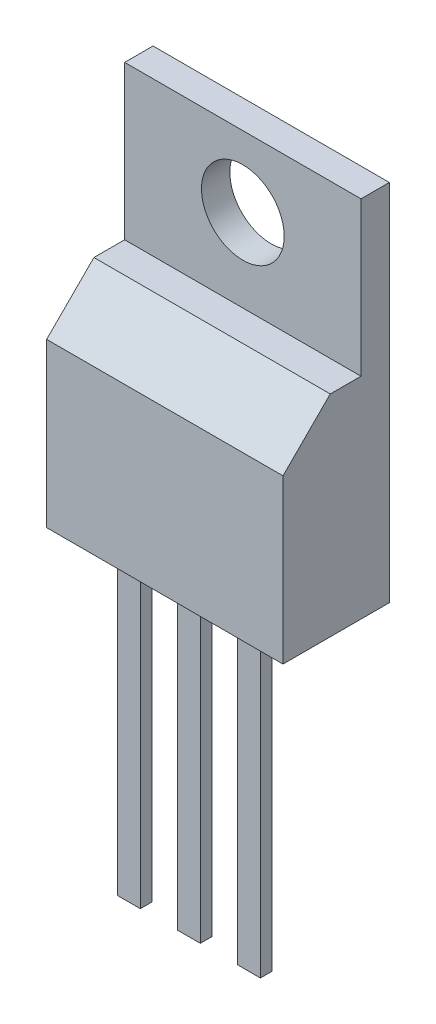
ISO-10303-21;
HEADER;
FILE_DESCRIPTION(('STEP AP214'),'2;1');
FILE_NAME('part.step','',(''),(''),'','','');
FILE_SCHEMA(('AUTOMOTIVE_DESIGN { 1 0 10303 214 1 1 1 1 }'));
ENDSEC;
DATA;
#1=APPLICATION_CONTEXT('core data for automotive mechanical design processes');
#2=APPLICATION_PROTOCOL_DEFINITION('international standard','automotive_design',2000,#1);
#3=PRODUCT_CONTEXT('',#1,'mechanical');
#4=PRODUCT('Part','Part','',(#3));
#5=PRODUCT_RELATED_PRODUCT_CATEGORY('part','',(#4));
#6=PRODUCT_DEFINITION_FORMATION('','',#4);
#7=PRODUCT_DEFINITION_CONTEXT('part definition',#1,'design');
#8=PRODUCT_DEFINITION('design','',#6,#7);
#9=PRODUCT_DEFINITION_SHAPE('','',#8);
#10=(LENGTH_UNIT() NAMED_UNIT(*) SI_UNIT(.MILLI.,.METRE.));
#11=(NAMED_UNIT(*) PLANE_ANGLE_UNIT() SI_UNIT($,.RADIAN.));
#12=(NAMED_UNIT(*) SI_UNIT($,.STERADIAN.) SOLID_ANGLE_UNIT());
#13=UNCERTAINTY_MEASURE_WITH_UNIT(LENGTH_MEASURE(1.E-05),#10,'distance_accuracy_value','');
#14=(GEOMETRIC_REPRESENTATION_CONTEXT(3) GLOBAL_UNCERTAINTY_ASSIGNED_CONTEXT((#13)) GLOBAL_UNIT_ASSIGNED_CONTEXT((#10,
#11,#12)) REPRESENTATION_CONTEXT('',''));
#15=CARTESIAN_POINT('',(0.,0.,0.));
#16=DIRECTION('',(0.,0.,1.));
#17=DIRECTION('',(1.,0.,0.));
#18=AXIS2_PLACEMENT_3D('',#15,#16,#17);
#19=CARTESIAN_POINT('',(-5.,0.,4.5));
#20=DIRECTION('',(0.,1.,0.));
#21=DIRECTION('',(-1.,0.,0.));
#22=AXIS2_PLACEMENT_3D('',#19,#20,#21);
#23=PLANE('',#22);
#24=DIRECTION('',(0.,0.,-1.));
#25=VECTOR('',#24,1.);
#26=CARTESIAN_POINT('',(2.0572012411108,0.,3.48));
#27=LINE('',#26,#25);
#28=CARTESIAN_POINT('',(2.0572012411108,0.,3.48));
#29=VERTEX_POINT('',#28);
#30=CARTESIAN_POINT('',(2.0572012411108,0.,2.98));
#31=VERTEX_POINT('',#30);
#32=EDGE_CURVE('E188',#29,#31,#27,.T.);
#33=ORIENTED_EDGE('',*,*,#32,.F.);
#34=DIRECTION('',(-1.,0.,0.));
#35=VECTOR('',#34,1.);
#36=CARTESIAN_POINT('',(2.0572012411108,0.,3.48));
#37=LINE('',#36,#35);
#38=CARTESIAN_POINT('',(3.0227987588892,0.,3.48));
#39=VERTEX_POINT('',#38);
#40=EDGE_CURVE('E201',#39,#29,#37,.T.);
#41=ORIENTED_EDGE('',*,*,#40,.F.);
#42=DIRECTION('',(0.,0.,1.));
#43=VECTOR('',#42,1.);
#44=CARTESIAN_POINT('',(3.0227987588892,0.,3.48));
#45=LINE('',#44,#43);
#46=CARTESIAN_POINT('',(3.0227987588892,0.,2.98));
#47=VERTEX_POINT('',#46);
#48=EDGE_CURVE('E210',#47,#39,#45,.T.);
#49=ORIENTED_EDGE('',*,*,#48,.F.);
#50=DIRECTION('',(1.,0.,0.));
#51=VECTOR('',#50,1.);
#52=CARTESIAN_POINT('',(2.0572012411108,0.,2.98));
#53=LINE('',#52,#51);
#54=EDGE_CURVE('E191',#31,#47,#53,.T.);
#55=ORIENTED_EDGE('',*,*,#54,.F.);
#56=EDGE_LOOP('',(#33,#41,#49,#55));
#57=FACE_BOUND('',#56,.T.);
#58=DIRECTION('',(1.,0.,0.));
#59=VECTOR('',#58,1.);
#60=CARTESIAN_POINT('',(-5.,0.,0.));
#61=LINE('',#60,#59);
#62=CARTESIAN_POINT('',(-5.,0.,0.));
#63=VERTEX_POINT('',#62);
#64=CARTESIAN_POINT('',(5.,0.,0.));
#65=VERTEX_POINT('',#64);
#66=EDGE_CURVE('E294',#63,#65,#61,.T.);
#67=ORIENTED_EDGE('',*,*,#66,.T.);
#68=DIRECTION('',(0.,0.,-1.));
#69=VECTOR('',#68,1.);
#70=CARTESIAN_POINT('',(5.,0.,4.5));
#71=LINE('',#70,#69);
#72=CARTESIAN_POINT('',(5.,0.,4.5));
#73=VERTEX_POINT('',#72);
#74=EDGE_CURVE('E304',#73,#65,#71,.T.);
#75=ORIENTED_EDGE('',*,*,#74,.F.);
#76=DIRECTION('',(1.,0.,0.));
#77=VECTOR('',#76,1.);
#78=CARTESIAN_POINT('',(-5.,0.,4.5));
#79=LINE('',#78,#77);
#80=CARTESIAN_POINT('',(-5.,0.,4.5));
#81=VERTEX_POINT('',#80);
#82=EDGE_CURVE('E285',#81,#73,#79,.T.);
#83=ORIENTED_EDGE('',*,*,#82,.F.);
#84=DIRECTION('',(0.,0.,-1.));
#85=VECTOR('',#84,1.);
#86=CARTESIAN_POINT('',(-5.,0.,4.5));
#87=LINE('',#86,#85);
#88=EDGE_CURVE('E307',#81,#63,#87,.T.);
#89=ORIENTED_EDGE('',*,*,#88,.T.);
#90=EDGE_LOOP('',(#67,#75,#83,#89));
#91=FACE_BOUND('',#90,.T.);
#92=DIRECTION('',(0.,0.,-1.));
#93=VECTOR('',#92,1.);
#94=CARTESIAN_POINT('',(-0.482798758889201,0.,3.48));
#95=LINE('',#94,#93);
#96=CARTESIAN_POINT('',(-0.482798758889201,0.,3.48));
#97=VERTEX_POINT('',#96);
#98=CARTESIAN_POINT('',(-0.482798758889201,0.,2.98));
#99=VERTEX_POINT('',#98);
#100=EDGE_CURVE('E226',#97,#99,#95,.T.);
#101=ORIENTED_EDGE('',*,*,#100,.F.);
#102=DIRECTION('',(-1.,0.,0.));
#103=VECTOR('',#102,1.);
#104=CARTESIAN_POINT('',(-0.482798758889201,0.,3.48));
#105=LINE('',#104,#103);
#106=CARTESIAN_POINT('',(0.482798758889204,0.,3.48));
#107=VERTEX_POINT('',#106);
#108=EDGE_CURVE('E231',#107,#97,#105,.T.);
#109=ORIENTED_EDGE('',*,*,#108,.F.);
#110=DIRECTION('',(0.,0.,1.));
#111=VECTOR('',#110,1.);
#112=CARTESIAN_POINT('',(0.482798758889201,0.,3.48));
#113=LINE('',#112,#111);
#114=CARTESIAN_POINT('',(0.482798758889201,0.,2.98));
#115=VERTEX_POINT('',#114);
#116=EDGE_CURVE('E243',#115,#107,#113,.T.);
#117=ORIENTED_EDGE('',*,*,#116,.F.);
#118=DIRECTION('',(1.,0.,0.));
#119=VECTOR('',#118,1.);
#120=CARTESIAN_POINT('',(-0.482798758889201,0.,2.98));
#121=LINE('',#120,#119);
#122=EDGE_CURVE('E240',#99,#115,#121,.T.);
#123=ORIENTED_EDGE('',*,*,#122,.F.);
#124=EDGE_LOOP('',(#101,#109,#117,#123));
#125=FACE_BOUND('',#124,.T.);
#126=DIRECTION('',(0.,0.,-1.));
#127=VECTOR('',#126,1.);
#128=CARTESIAN_POINT('',(-3.0227987588892,0.,3.47999999999998));
#129=LINE('',#128,#127);
#130=CARTESIAN_POINT('',(-3.0227987588892,0.,3.47999999999998));
#131=VERTEX_POINT('',#130);
#132=CARTESIAN_POINT('',(-3.0227987588892,0.,2.97999999999998));
#133=VERTEX_POINT('',#132);
#134=EDGE_CURVE('E187',#131,#133,#129,.T.);
#135=ORIENTED_EDGE('',*,*,#134,.F.);
#136=DIRECTION('',(-1.,0.,0.));
#137=VECTOR('',#136,1.);
#138=CARTESIAN_POINT('',(-3.0227987588892,0.,3.47999999999998));
#139=LINE('',#138,#137);
#140=CARTESIAN_POINT('',(-2.0572012411108,0.,3.47999999999998));
#141=VERTEX_POINT('',#140);
#142=EDGE_CURVE('E184',#141,#131,#139,.T.);
#143=ORIENTED_EDGE('',*,*,#142,.F.);
#144=DIRECTION('',(0.,0.,1.));
#145=VECTOR('',#144,1.);
#146=CARTESIAN_POINT('',(-2.0572012411108,0.,3.47999999999998));
#147=LINE('',#146,#145);
#148=CARTESIAN_POINT('',(-2.0572012411108,0.,2.97999999999998));
#149=VERTEX_POINT('',#148);
#150=EDGE_CURVE('E57',#149,#141,#147,.T.);
#151=ORIENTED_EDGE('',*,*,#150,.F.);
#152=DIRECTION('',(1.,0.,0.));
#153=VECTOR('',#152,1.);
#154=CARTESIAN_POINT('',(-3.0227987588892,0.,2.97999999999998));
#155=LINE('',#154,#153);
#156=EDGE_CURVE('E52',#133,#149,#155,.T.);
#157=ORIENTED_EDGE('',*,*,#156,.F.);
#158=EDGE_LOOP('',(#135,#143,#151,#157));
#159=FACE_BOUND('',#158,.T.);
#160=ADVANCED_FACE('F37',(#57,#91,#125,#159),#23,.F.);
#161=CARTESIAN_POINT('',(-4.99999999999999,15.4,4.5));
#162=DIRECTION('',(0.,-1.,0.));
#163=DIRECTION('',(1.,0.,0.));
#164=AXIS2_PLACEMENT_3D('',#161,#162,#163);
#165=PLANE('',#164);
#166=DIRECTION('',(1.,0.,0.));
#167=VECTOR('',#166,1.);
#168=CARTESIAN_POINT('',(-4.99999999999999,15.4,1.2));
#169=LINE('',#168,#167);
#170=CARTESIAN_POINT('',(-4.99999999999999,15.4,1.2));
#171=VERTEX_POINT('',#170);
#172=CARTESIAN_POINT('',(5.,15.4,1.2));
#173=VERTEX_POINT('',#172);
#174=EDGE_CURVE('E269',#171,#173,#169,.T.);
#175=ORIENTED_EDGE('',*,*,#174,.T.);
#176=DIRECTION('',(0.,0.,-1.));
#177=VECTOR('',#176,1.);
#178=CARTESIAN_POINT('',(5.,15.4,4.5));
#179=LINE('',#178,#177);
#180=CARTESIAN_POINT('',(5.,15.4,0.));
#181=VERTEX_POINT('',#180);
#182=EDGE_CURVE('E302',#173,#181,#179,.T.);
#183=ORIENTED_EDGE('',*,*,#182,.T.);
#184=DIRECTION('',(-1.,0.,0.));
#185=VECTOR('',#184,1.);
#186=CARTESIAN_POINT('',(-4.99999999999999,15.4,0.));
#187=LINE('',#186,#185);
#188=CARTESIAN_POINT('',(-4.99999999999999,15.4,0.));
#189=VERTEX_POINT('',#188);
#190=EDGE_CURVE('E286',#181,#189,#187,.T.);
#191=ORIENTED_EDGE('',*,*,#190,.T.);
#192=DIRECTION('',(0.,0.,-1.));
#193=VECTOR('',#192,1.);
#194=CARTESIAN_POINT('',(-4.99999999999999,15.4,4.5));
#195=LINE('',#194,#193);
#196=EDGE_CURVE('E291',#171,#189,#195,.T.);
#197=ORIENTED_EDGE('',*,*,#196,.F.);
#198=EDGE_LOOP('',(#175,#183,#191,#197));
#199=FACE_BOUND('',#198,.T.);
#200=ADVANCED_FACE('F338',(#199),#165,.F.);
#201=CARTESIAN_POINT('',(-4.99999999999999,15.4,4.5));
#202=DIRECTION('',(1.,0.,0.));
#203=DIRECTION('',(0.,1.,0.));
#204=AXIS2_PLACEMENT_3D('',#201,#202,#203);
#205=PLANE('',#204);
#206=DIRECTION('',(0.,-1.,0.));
#207=VECTOR('',#206,1.);
#208=CARTESIAN_POINT('',(-4.99999999999999,15.4,4.5));
#209=LINE('',#208,#207);
#210=CARTESIAN_POINT('',(-5.,6.89999999999999,4.5));
#211=VERTEX_POINT('',#210);
#212=EDGE_CURVE('E283',#211,#81,#209,.T.);
#213=ORIENTED_EDGE('',*,*,#212,.F.);
#214=DIRECTION('',(0.,0.707106781186549,-0.707106781186546));
#215=VECTOR('',#214,1.);
#216=CARTESIAN_POINT('',(-5.,8.9,2.5));
#217=LINE('',#216,#215);
#218=CARTESIAN_POINT('',(-5.,8.9,2.49999999999999));
#219=VERTEX_POINT('',#218);
#220=EDGE_CURVE('E12',#211,#219,#217,.T.);
#221=ORIENTED_EDGE('',*,*,#220,.T.);
#222=DIRECTION('',(0.,0.,1.));
#223=VECTOR('',#222,1.);
#224=CARTESIAN_POINT('',(-4.99999999999999,8.9,-11.9268604418766));
#225=LINE('',#224,#223);
#226=CARTESIAN_POINT('',(-4.99999999999999,8.9,1.2));
#227=VERTEX_POINT('',#226);
#228=EDGE_CURVE('E263',#227,#219,#225,.T.);
#229=ORIENTED_EDGE('',*,*,#228,.F.);
#230=DIRECTION('',(0.,1.,0.));
#231=VECTOR('',#230,1.);
#232=CARTESIAN_POINT('',(-4.99999999999999,15.4,1.2));
#233=LINE('',#232,#231);
#234=EDGE_CURVE('E273',#227,#171,#233,.T.);
#235=ORIENTED_EDGE('',*,*,#234,.T.);
#236=ORIENTED_EDGE('',*,*,#196,.T.);
#237=DIRECTION('',(0.,-1.,0.));
#238=VECTOR('',#237,1.);
#239=CARTESIAN_POINT('',(-4.99999999999999,15.4,0.));
#240=LINE('',#239,#238);
#241=EDGE_CURVE('E282',#189,#63,#240,.T.);
#242=ORIENTED_EDGE('',*,*,#241,.T.);
#243=ORIENTED_EDGE('',*,*,#88,.F.);
#244=EDGE_LOOP('',(#213,#221,#229,#235,#236,#242,#243));
#245=FACE_BOUND('',#244,.T.);
#246=ADVANCED_FACE('F324',(#245),#205,.F.);
#247=CARTESIAN_POINT('',(5.,15.4,4.5));
#248=DIRECTION('',(-1.,0.,0.));
#249=DIRECTION('',(0.,-1.,0.));
#250=AXIS2_PLACEMENT_3D('',#247,#248,#249);
#251=PLANE('',#250);
#252=DIRECTION('',(0.,0.,1.));
#253=VECTOR('',#252,1.);
#254=CARTESIAN_POINT('',(5.,8.9,-11.9268604418766));
#255=LINE('',#254,#253);
#256=CARTESIAN_POINT('',(5.,8.9,1.2));
#257=VERTEX_POINT('',#256);
#258=CARTESIAN_POINT('',(5.,8.9,2.49999999999999));
#259=VERTEX_POINT('',#258);
#260=EDGE_CURVE('E270',#257,#259,#255,.T.);
#261=ORIENTED_EDGE('',*,*,#260,.T.);
#262=DIRECTION('',(0.,-0.707106781186549,0.707106781186546));
#263=VECTOR('',#262,1.);
#264=CARTESIAN_POINT('',(5.,8.9,2.5));
#265=LINE('',#264,#263);
#266=CARTESIAN_POINT('',(5.,6.89999999999999,4.5));
#267=VERTEX_POINT('',#266);
#268=EDGE_CURVE('E313',#259,#267,#265,.T.);
#269=ORIENTED_EDGE('',*,*,#268,.T.);
#270=DIRECTION('',(0.,1.,0.));
#271=VECTOR('',#270,1.);
#272=CARTESIAN_POINT('',(5.,15.4,4.5));
#273=LINE('',#272,#271);
#274=EDGE_CURVE('E288',#73,#267,#273,.T.);
#275=ORIENTED_EDGE('',*,*,#274,.F.);
#276=ORIENTED_EDGE('',*,*,#74,.T.);
#277=DIRECTION('',(0.,1.,0.));
#278=VECTOR('',#277,1.);
#279=CARTESIAN_POINT('',(5.,15.4,0.));
#280=LINE('',#279,#278);
#281=EDGE_CURVE('E296',#65,#181,#280,.T.);
#282=ORIENTED_EDGE('',*,*,#281,.T.);
#283=ORIENTED_EDGE('',*,*,#182,.F.);
#284=DIRECTION('',(0.,-1.,0.));
#285=VECTOR('',#284,1.);
#286=CARTESIAN_POINT('',(5.,15.4,1.2));
#287=LINE('',#286,#285);
#288=EDGE_CURVE('E266',#173,#257,#287,.T.);
#289=ORIENTED_EDGE('',*,*,#288,.T.);
#290=EDGE_LOOP('',(#261,#269,#275,#276,#282,#283,#289));
#291=FACE_BOUND('',#290,.T.);
#292=ADVANCED_FACE('F331',(#291),#251,.F.);
#293=CARTESIAN_POINT('',(0.,0.,4.5));
#294=DIRECTION('',(0.,0.,1.));
#295=DIRECTION('',(1.,0.,0.));
#296=AXIS2_PLACEMENT_3D('',#293,#294,#295);
#297=PLANE('',#296);
#298=ORIENTED_EDGE('',*,*,#274,.T.);
#299=DIRECTION('',(-1.,0.,0.));
#300=VECTOR('',#299,1.);
#301=CARTESIAN_POINT('',(-5.,6.89999999999999,4.5));
#302=LINE('',#301,#300);
#303=EDGE_CURVE('E45',#267,#211,#302,.T.);
#304=ORIENTED_EDGE('',*,*,#303,.T.);
#305=ORIENTED_EDGE('',*,*,#212,.T.);
#306=ORIENTED_EDGE('',*,*,#82,.T.);
#307=EDGE_LOOP('',(#298,#304,#305,#306));
#308=FACE_BOUND('',#307,.T.);
#309=ADVANCED_FACE('F317',(#308),#297,.T.);
#310=CARTESIAN_POINT('',(0.,0.,0.));
#311=DIRECTION('',(0.,0.,1.));
#312=DIRECTION('',(1.,0.,0.));
#313=AXIS2_PLACEMENT_3D('',#310,#311,#312);
#314=PLANE('',#313);
#315=CARTESIAN_POINT('',(0.,12.4,0.));
#316=DIRECTION('',(0.,0.,1.));
#317=DIRECTION('',(1.,0.,0.));
#318=AXIS2_PLACEMENT_3D('',#315,#316,#317);
#319=CIRCLE('',#318,1.75);
#320=CARTESIAN_POINT('',(1.75,12.4,0.));
#321=VERTEX_POINT('',#320);
#322=EDGE_CURVE('E260',#321,#321,#319,.T.);
#323=ORIENTED_EDGE('',*,*,#322,.T.);
#324=EDGE_LOOP('',(#323));
#325=FACE_BOUND('',#324,.T.);
#326=ORIENTED_EDGE('',*,*,#241,.F.);
#327=ORIENTED_EDGE('',*,*,#190,.F.);
#328=ORIENTED_EDGE('',*,*,#281,.F.);
#329=ORIENTED_EDGE('',*,*,#66,.F.);
#330=EDGE_LOOP('',(#326,#327,#328,#329));
#331=FACE_BOUND('',#330,.T.);
#332=ADVANCED_FACE('F342',(#325,#331),#314,.F.);
#333=CARTESIAN_POINT('',(-4.99999999999999,8.9,-11.9268604418766));
#334=DIRECTION('',(0.,-1.,0.));
#335=DIRECTION('',(0.,0.,-1.));
#336=AXIS2_PLACEMENT_3D('',#333,#334,#335);
#337=PLANE('',#336);
#338=ORIENTED_EDGE('',*,*,#228,.T.);
#339=DIRECTION('',(1.,0.,0.));
#340=VECTOR('',#339,1.);
#341=CARTESIAN_POINT('',(5.,8.9,2.5));
#342=LINE('',#341,#340);
#343=EDGE_CURVE('E310',#219,#259,#342,.T.);
#344=ORIENTED_EDGE('',*,*,#343,.T.);
#345=ORIENTED_EDGE('',*,*,#260,.F.);
#346=DIRECTION('',(-1.,0.,0.));
#347=VECTOR('',#346,1.);
#348=CARTESIAN_POINT('',(-4.99999999999999,8.9,1.2));
#349=LINE('',#348,#347);
#350=EDGE_CURVE('E276',#257,#227,#349,.T.);
#351=ORIENTED_EDGE('',*,*,#350,.T.);
#352=EDGE_LOOP('',(#338,#344,#345,#351));
#353=FACE_BOUND('',#352,.T.);
#354=ADVANCED_FACE('F328',(#353),#337,.F.);
#355=CARTESIAN_POINT('',(0.,0.,1.2));
#356=DIRECTION('',(0.,0.,1.));
#357=DIRECTION('',(1.,0.,0.));
#358=AXIS2_PLACEMENT_3D('',#355,#356,#357);
#359=PLANE('',#358);
#360=CARTESIAN_POINT('',(0.,12.4,1.2));
#361=DIRECTION('',(0.,0.,1.));
#362=DIRECTION('',(1.,0.,0.));
#363=AXIS2_PLACEMENT_3D('',#360,#361,#362);
#364=CIRCLE('',#363,1.75);
#365=CARTESIAN_POINT('',(1.75,12.4,1.2));
#366=VERTEX_POINT('',#365);
#367=EDGE_CURVE('E259',#366,#366,#364,.T.);
#368=ORIENTED_EDGE('',*,*,#367,.F.);
#369=EDGE_LOOP('',(#368));
#370=FACE_BOUND('',#369,.T.);
#371=ORIENTED_EDGE('',*,*,#234,.F.);
#372=ORIENTED_EDGE('',*,*,#350,.F.);
#373=ORIENTED_EDGE('',*,*,#288,.F.);
#374=ORIENTED_EDGE('',*,*,#174,.F.);
#375=EDGE_LOOP('',(#371,#372,#373,#374));
#376=FACE_BOUND('',#375,.T.);
#377=ADVANCED_FACE('F335',(#370,#376),#359,.T.);
#378=CARTESIAN_POINT('',(-4.99999999999999,8.9,2.5));
#379=DIRECTION('',(0.,0.707106781186546,0.707106781186549));
#380=DIRECTION('',(-1.,0.,0.));
#381=AXIS2_PLACEMENT_3D('',#378,#379,#380);
#382=PLANE('',#381);
#383=ORIENTED_EDGE('',*,*,#220,.F.);
#384=ORIENTED_EDGE('',*,*,#303,.F.);
#385=ORIENTED_EDGE('',*,*,#268,.F.);
#386=ORIENTED_EDGE('',*,*,#343,.F.);
#387=EDGE_LOOP('',(#383,#384,#385,#386));
#388=FACE_BOUND('',#387,.T.);
#389=ADVANCED_FACE('F39',(#388),#382,.T.);
#390=CARTESIAN_POINT('',(0.,12.4,0.));
#391=DIRECTION('',(0.,0.,1.));
#392=DIRECTION('',(1.,0.,0.));
#393=AXIS2_PLACEMENT_3D('',#390,#391,#392);
#394=CYLINDRICAL_SURFACE('',#393,1.75);
#395=ORIENTED_EDGE('',*,*,#322,.F.);
#396=EDGE_LOOP('',(#395));
#397=FACE_BOUND('',#396,.T.);
#398=ORIENTED_EDGE('',*,*,#367,.T.);
#399=EDGE_LOOP('',(#398));
#400=FACE_BOUND('',#399,.T.);
#401=ADVANCED_FACE('F416',(#397,#400),#394,.F.);
#402=CARTESIAN_POINT('',(-0.482798758889199,-13.,3.48));
#403=DIRECTION('',(1.,0.,0.));
#404=DIRECTION('',(0.,1.,0.));
#405=AXIS2_PLACEMENT_3D('',#402,#403,#404);
#406=PLANE('',#405);
#407=ORIENTED_EDGE('',*,*,#100,.T.);
#408=DIRECTION('',(0.,1.,0.));
#409=VECTOR('',#408,1.);
#410=CARTESIAN_POINT('',(-0.482798758889199,-13.,2.98));
#411=LINE('',#410,#409);
#412=CARTESIAN_POINT('',(-0.482798758889199,-13.,2.98));
#413=VERTEX_POINT('',#412);
#414=EDGE_CURVE('E256',#413,#99,#411,.T.);
#415=ORIENTED_EDGE('',*,*,#414,.F.);
#416=DIRECTION('',(0.,0.,-1.));
#417=VECTOR('',#416,1.);
#418=CARTESIAN_POINT('',(-0.482798758889199,-13.,3.48));
#419=LINE('',#418,#417);
#420=CARTESIAN_POINT('',(-0.482798758889199,-13.,3.48));
#421=VERTEX_POINT('',#420);
#422=EDGE_CURVE('E227',#421,#413,#419,.T.);
#423=ORIENTED_EDGE('',*,*,#422,.F.);
#424=DIRECTION('',(0.,1.,0.));
#425=VECTOR('',#424,1.);
#426=CARTESIAN_POINT('',(-0.482798758889199,-13.,3.48));
#427=LINE('',#426,#425);
#428=EDGE_CURVE('E237',#421,#97,#427,.T.);
#429=ORIENTED_EDGE('',*,*,#428,.T.);
#430=EDGE_LOOP('',(#407,#415,#423,#429));
#431=FACE_BOUND('',#430,.T.);
#432=ADVANCED_FACE('F412',(#431),#406,.F.);
#433=CARTESIAN_POINT('',(-0.482798758889199,-13.,2.98));
#434=DIRECTION('',(0.,0.,1.));
#435=DIRECTION('',(1.,0.,0.));
#436=AXIS2_PLACEMENT_3D('',#433,#434,#435);
#437=PLANE('',#436);
#438=ORIENTED_EDGE('',*,*,#122,.T.);
#439=DIRECTION('',(0.,1.,0.));
#440=VECTOR('',#439,1.);
#441=CARTESIAN_POINT('',(0.482798758889203,-13.,2.98));
#442=LINE('',#441,#440);
#443=CARTESIAN_POINT('',(0.482798758889203,-13.,2.98));
#444=VERTEX_POINT('',#443);
#445=EDGE_CURVE('E253',#444,#115,#442,.T.);
#446=ORIENTED_EDGE('',*,*,#445,.F.);
#447=DIRECTION('',(1.,0.,0.));
#448=VECTOR('',#447,1.);
#449=CARTESIAN_POINT('',(-0.482798758889199,-13.,2.98));
#450=LINE('',#449,#448);
#451=EDGE_CURVE('E230',#413,#444,#450,.T.);
#452=ORIENTED_EDGE('',*,*,#451,.F.);
#453=ORIENTED_EDGE('',*,*,#414,.T.);
#454=EDGE_LOOP('',(#438,#446,#452,#453));
#455=FACE_BOUND('',#454,.T.);
#456=ADVANCED_FACE('F408',(#455),#437,.F.);
#457=CARTESIAN_POINT('',(0.482798758889203,-13.,3.48));
#458=DIRECTION('',(-1.,0.,0.));
#459=DIRECTION('',(0.,-1.,0.));
#460=AXIS2_PLACEMENT_3D('',#457,#458,#459);
#461=PLANE('',#460);
#462=ORIENTED_EDGE('',*,*,#116,.T.);
#463=DIRECTION('',(0.,1.,0.));
#464=VECTOR('',#463,1.);
#465=CARTESIAN_POINT('',(0.482798758889203,-13.,3.48));
#466=LINE('',#465,#464);
#467=CARTESIAN_POINT('',(0.482798758889203,-13.,3.48));
#468=VERTEX_POINT('',#467);
#469=EDGE_CURVE('E250',#468,#107,#466,.T.);
#470=ORIENTED_EDGE('',*,*,#469,.F.);
#471=DIRECTION('',(0.,0.,1.));
#472=VECTOR('',#471,1.);
#473=CARTESIAN_POINT('',(0.482798758889203,-13.,3.48));
#474=LINE('',#473,#472);
#475=EDGE_CURVE('E233',#444,#468,#474,.T.);
#476=ORIENTED_EDGE('',*,*,#475,.F.);
#477=ORIENTED_EDGE('',*,*,#445,.T.);
#478=EDGE_LOOP('',(#462,#470,#476,#477));
#479=FACE_BOUND('',#478,.T.);
#480=ADVANCED_FACE('F404',(#479),#461,.F.);
#481=CARTESIAN_POINT('',(-0.482798758889199,-13.,3.48));
#482=DIRECTION('',(0.,0.,-1.));
#483=DIRECTION('',(-1.,0.,0.));
#484=AXIS2_PLACEMENT_3D('',#481,#482,#483);
#485=PLANE('',#484);
#486=ORIENTED_EDGE('',*,*,#108,.T.);
#487=ORIENTED_EDGE('',*,*,#428,.F.);
#488=DIRECTION('',(-1.,0.,0.));
#489=VECTOR('',#488,1.);
#490=CARTESIAN_POINT('',(-0.482798758889199,-13.,3.48));
#491=LINE('',#490,#489);
#492=EDGE_CURVE('E235',#468,#421,#491,.T.);
#493=ORIENTED_EDGE('',*,*,#492,.F.);
#494=ORIENTED_EDGE('',*,*,#469,.T.);
#495=EDGE_LOOP('',(#486,#487,#493,#494));
#496=FACE_BOUND('',#495,.T.);
#497=ADVANCED_FACE('F400',(#496),#485,.F.);
#498=CARTESIAN_POINT('',(0.,-13.,0.));
#499=DIRECTION('',(0.,-1.,0.));
#500=DIRECTION('',(1.,0.,0.));
#501=AXIS2_PLACEMENT_3D('',#498,#499,#500);
#502=PLANE('',#501);
#503=ORIENTED_EDGE('',*,*,#422,.T.);
#504=ORIENTED_EDGE('',*,*,#451,.T.);
#505=ORIENTED_EDGE('',*,*,#475,.T.);
#506=ORIENTED_EDGE('',*,*,#492,.T.);
#507=EDGE_LOOP('',(#503,#504,#505,#506));
#508=FACE_BOUND('',#507,.T.);
#509=ADVANCED_FACE('F396',(#508),#502,.T.);
#510=CARTESIAN_POINT('',(2.0572012411108,-13.,3.48));
#511=DIRECTION('',(1.,0.,0.));
#512=DIRECTION('',(0.,1.,0.));
#513=AXIS2_PLACEMENT_3D('',#510,#511,#512);
#514=PLANE('',#513);
#515=ORIENTED_EDGE('',*,*,#32,.T.);
#516=DIRECTION('',(0.,1.,0.));
#517=VECTOR('',#516,1.);
#518=CARTESIAN_POINT('',(2.0572012411108,-13.,2.98));
#519=LINE('',#518,#517);
#520=CARTESIAN_POINT('',(2.0572012411108,-13.,2.98));
#521=VERTEX_POINT('',#520);
#522=EDGE_CURVE('E223',#521,#31,#519,.T.);
#523=ORIENTED_EDGE('',*,*,#522,.F.);
#524=DIRECTION('',(0.,0.,-1.));
#525=VECTOR('',#524,1.);
#526=CARTESIAN_POINT('',(2.0572012411108,-13.,3.48));
#527=LINE('',#526,#525);
#528=CARTESIAN_POINT('',(2.0572012411108,-13.,3.48));
#529=VERTEX_POINT('',#528);
#530=EDGE_CURVE('E197',#529,#521,#527,.T.);
#531=ORIENTED_EDGE('',*,*,#530,.F.);
#532=DIRECTION('',(0.,1.,0.));
#533=VECTOR('',#532,1.);
#534=CARTESIAN_POINT('',(2.0572012411108,-13.,3.48));
#535=LINE('',#534,#533);
#536=EDGE_CURVE('E206',#529,#29,#535,.T.);
#537=ORIENTED_EDGE('',*,*,#536,.T.);
#538=EDGE_LOOP('',(#515,#523,#531,#537));
#539=FACE_BOUND('',#538,.T.);
#540=ADVANCED_FACE('F392',(#539),#514,.F.);
#541=CARTESIAN_POINT('',(2.0572012411108,-13.,2.98));
#542=DIRECTION('',(0.,0.,1.));
#543=DIRECTION('',(1.,0.,0.));
#544=AXIS2_PLACEMENT_3D('',#541,#542,#543);
#545=PLANE('',#544);
#546=ORIENTED_EDGE('',*,*,#54,.T.);
#547=DIRECTION('',(0.,1.,0.));
#548=VECTOR('',#547,1.);
#549=CARTESIAN_POINT('',(3.0227987588892,-13.,2.98));
#550=LINE('',#549,#548);
#551=CARTESIAN_POINT('',(3.0227987588892,-13.,2.98));
#552=VERTEX_POINT('',#551);
#553=EDGE_CURVE('E220',#552,#47,#550,.T.);
#554=ORIENTED_EDGE('',*,*,#553,.F.);
#555=DIRECTION('',(1.,0.,0.));
#556=VECTOR('',#555,1.);
#557=CARTESIAN_POINT('',(2.0572012411108,-13.,2.98));
#558=LINE('',#557,#556);
#559=EDGE_CURVE('E200',#521,#552,#558,.T.);
#560=ORIENTED_EDGE('',*,*,#559,.F.);
#561=ORIENTED_EDGE('',*,*,#522,.T.);
#562=EDGE_LOOP('',(#546,#554,#560,#561));
#563=FACE_BOUND('',#562,.T.);
#564=ADVANCED_FACE('F388',(#563),#545,.F.);
#565=CARTESIAN_POINT('',(3.0227987588892,-13.,3.48));
#566=DIRECTION('',(-1.,0.,0.));
#567=DIRECTION('',(0.,-1.,0.));
#568=AXIS2_PLACEMENT_3D('',#565,#566,#567);
#569=PLANE('',#568);
#570=ORIENTED_EDGE('',*,*,#48,.T.);
#571=DIRECTION('',(0.,1.,0.));
#572=VECTOR('',#571,1.);
#573=CARTESIAN_POINT('',(3.0227987588892,-13.,3.48));
#574=LINE('',#573,#572);
#575=CARTESIAN_POINT('',(3.0227987588892,-13.,3.48));
#576=VERTEX_POINT('',#575);
#577=EDGE_CURVE('E217',#576,#39,#574,.T.);
#578=ORIENTED_EDGE('',*,*,#577,.F.);
#579=DIRECTION('',(0.,0.,1.));
#580=VECTOR('',#579,1.);
#581=CARTESIAN_POINT('',(3.0227987588892,-13.,3.48));
#582=LINE('',#581,#580);
#583=EDGE_CURVE('E203',#552,#576,#582,.T.);
#584=ORIENTED_EDGE('',*,*,#583,.F.);
#585=ORIENTED_EDGE('',*,*,#553,.T.);
#586=EDGE_LOOP('',(#570,#578,#584,#585));
#587=FACE_BOUND('',#586,.T.);
#588=ADVANCED_FACE('F384',(#587),#569,.F.);
#589=CARTESIAN_POINT('',(2.0572012411108,-13.,3.48));
#590=DIRECTION('',(0.,0.,-1.));
#591=DIRECTION('',(-1.,0.,0.));
#592=AXIS2_PLACEMENT_3D('',#589,#590,#591);
#593=PLANE('',#592);
#594=ORIENTED_EDGE('',*,*,#40,.T.);
#595=ORIENTED_EDGE('',*,*,#536,.F.);
#596=DIRECTION('',(-1.,0.,0.));
#597=VECTOR('',#596,1.);
#598=CARTESIAN_POINT('',(2.0572012411108,-13.,3.48));
#599=LINE('',#598,#597);
#600=EDGE_CURVE('E205',#576,#529,#599,.T.);
#601=ORIENTED_EDGE('',*,*,#600,.F.);
#602=ORIENTED_EDGE('',*,*,#577,.T.);
#603=EDGE_LOOP('',(#594,#595,#601,#602));
#604=FACE_BOUND('',#603,.T.);
#605=ADVANCED_FACE('F380',(#604),#593,.F.);
#606=CARTESIAN_POINT('',(0.,-13.,0.));
#607=DIRECTION('',(0.,-1.,0.));
#608=DIRECTION('',(1.,0.,0.));
#609=AXIS2_PLACEMENT_3D('',#606,#607,#608);
#610=PLANE('',#609);
#611=ORIENTED_EDGE('',*,*,#530,.T.);
#612=ORIENTED_EDGE('',*,*,#559,.T.);
#613=ORIENTED_EDGE('',*,*,#583,.T.);
#614=ORIENTED_EDGE('',*,*,#600,.T.);
#615=EDGE_LOOP('',(#611,#612,#613,#614));
#616=FACE_BOUND('',#615,.T.);
#617=ADVANCED_FACE('F377',(#616),#610,.T.);
#618=CARTESIAN_POINT('',(-3.0227987588892,-13.,3.47999999999998));
#619=DIRECTION('',(1.,0.,0.));
#620=DIRECTION('',(0.,1.,0.));
#621=AXIS2_PLACEMENT_3D('',#618,#619,#620);
#622=PLANE('',#621);
#623=ORIENTED_EDGE('',*,*,#134,.T.);
#624=DIRECTION('',(0.,1.,0.));
#625=VECTOR('',#624,1.);
#626=CARTESIAN_POINT('',(-3.0227987588892,-13.,2.97999999999998));
#627=LINE('',#626,#625);
#628=CARTESIAN_POINT('',(-3.0227987588892,-13.,2.97999999999998));
#629=VERTEX_POINT('',#628);
#630=EDGE_CURVE('E168',#629,#133,#627,.T.);
#631=ORIENTED_EDGE('',*,*,#630,.F.);
#632=DIRECTION('',(0.,0.,-1.));
#633=VECTOR('',#632,1.);
#634=CARTESIAN_POINT('',(-3.0227987588892,-13.,3.47999999999998));
#635=LINE('',#634,#633);
#636=CARTESIAN_POINT('',(-3.0227987588892,-13.,3.47999999999998));
#637=VERTEX_POINT('',#636);
#638=EDGE_CURVE('E175',#637,#629,#635,.T.);
#639=ORIENTED_EDGE('',*,*,#638,.F.);
#640=DIRECTION('',(0.,1.,0.));
#641=VECTOR('',#640,1.);
#642=CARTESIAN_POINT('',(-3.0227987588892,-13.,3.47999999999998));
#643=LINE('',#642,#641);
#644=EDGE_CURVE('E355',#637,#131,#643,.T.);
#645=ORIENTED_EDGE('',*,*,#644,.T.);
#646=EDGE_LOOP('',(#623,#631,#639,#645));
#647=FACE_BOUND('',#646,.T.);
#648=ADVANCED_FACE('F186',(#647),#622,.F.);
#649=CARTESIAN_POINT('',(-3.0227987588892,-13.,2.97999999999998));
#650=DIRECTION('',(0.,0.,1.));
#651=DIRECTION('',(1.,0.,0.));
#652=AXIS2_PLACEMENT_3D('',#649,#650,#651);
#653=PLANE('',#652);
#654=ORIENTED_EDGE('',*,*,#156,.T.);
#655=DIRECTION('',(0.,1.,0.));
#656=VECTOR('',#655,1.);
#657=CARTESIAN_POINT('',(-2.0572012411108,-13.,2.97999999999998));
#658=LINE('',#657,#656);
#659=CARTESIAN_POINT('',(-2.0572012411108,-13.,2.97999999999998));
#660=VERTEX_POINT('',#659);
#661=EDGE_CURVE('E171',#660,#149,#658,.T.);
#662=ORIENTED_EDGE('',*,*,#661,.F.);
#663=DIRECTION('',(1.,0.,0.));
#664=VECTOR('',#663,1.);
#665=CARTESIAN_POINT('',(-3.0227987588892,-13.,2.97999999999998));
#666=LINE('',#665,#664);
#667=EDGE_CURVE('E164',#629,#660,#666,.T.);
#668=ORIENTED_EDGE('',*,*,#667,.F.);
#669=ORIENTED_EDGE('',*,*,#630,.T.);
#670=EDGE_LOOP('',(#654,#662,#668,#669));
#671=FACE_BOUND('',#670,.T.);
#672=ADVANCED_FACE('F166',(#671),#653,.F.);
#673=CARTESIAN_POINT('',(-2.0572012411108,-13.,3.47999999999998));
#674=DIRECTION('',(-1.,0.,0.));
#675=DIRECTION('',(0.,-1.,0.));
#676=AXIS2_PLACEMENT_3D('',#673,#674,#675);
#677=PLANE('',#676);
#678=ORIENTED_EDGE('',*,*,#150,.T.);
#679=DIRECTION('',(0.,1.,0.));
#680=VECTOR('',#679,1.);
#681=CARTESIAN_POINT('',(-2.0572012411108,-13.,3.47999999999998));
#682=LINE('',#681,#680);
#683=CARTESIAN_POINT('',(-2.0572012411108,-13.,3.47999999999998));
#684=VERTEX_POINT('',#683);
#685=EDGE_CURVE('E193',#684,#141,#682,.T.);
#686=ORIENTED_EDGE('',*,*,#685,.F.);
#687=DIRECTION('',(0.,0.,1.));
#688=VECTOR('',#687,1.);
#689=CARTESIAN_POINT('',(-2.0572012411108,-13.,3.47999999999998));
#690=LINE('',#689,#688);
#691=EDGE_CURVE('E174',#660,#684,#690,.T.);
#692=ORIENTED_EDGE('',*,*,#691,.F.);
#693=ORIENTED_EDGE('',*,*,#661,.T.);
#694=EDGE_LOOP('',(#678,#686,#692,#693));
#695=FACE_BOUND('',#694,.T.);
#696=ADVANCED_FACE('F364',(#695),#677,.F.);
#697=CARTESIAN_POINT('',(-3.0227987588892,-13.,3.47999999999998));
#698=DIRECTION('',(0.,0.,-1.));
#699=DIRECTION('',(-1.,0.,0.));
#700=AXIS2_PLACEMENT_3D('',#697,#698,#699);
#701=PLANE('',#700);
#702=ORIENTED_EDGE('',*,*,#142,.T.);
#703=ORIENTED_EDGE('',*,*,#644,.F.);
#704=DIRECTION('',(-1.,0.,0.));
#705=VECTOR('',#704,1.);
#706=CARTESIAN_POINT('',(-3.0227987588892,-13.,3.47999999999998));
#707=LINE('',#706,#705);
#708=EDGE_CURVE('E180',#684,#637,#707,.T.);
#709=ORIENTED_EDGE('',*,*,#708,.F.);
#710=ORIENTED_EDGE('',*,*,#685,.T.);
#711=EDGE_LOOP('',(#702,#703,#709,#710));
#712=FACE_BOUND('',#711,.T.);
#713=ADVANCED_FACE('F354',(#712),#701,.F.);
#714=CARTESIAN_POINT('',(0.,-13.,0.));
#715=DIRECTION('',(0.,-1.,0.));
#716=DIRECTION('',(1.,0.,0.));
#717=AXIS2_PLACEMENT_3D('',#714,#715,#716);
#718=PLANE('',#717);
#719=ORIENTED_EDGE('',*,*,#638,.T.);
#720=ORIENTED_EDGE('',*,*,#667,.T.);
#721=ORIENTED_EDGE('',*,*,#691,.T.);
#722=ORIENTED_EDGE('',*,*,#708,.T.);
#723=EDGE_LOOP('',(#719,#720,#721,#722));
#724=FACE_BOUND('',#723,.T.);
#725=ADVANCED_FACE('F178',(#724),#718,.T.);
#726=CLOSED_SHELL('',(#160,#200,#246,#292,#309,#332,#354,#377,#389,#401,#432,#456,#480,#497,
#509,#540,#564,#588,#605,#617,#648,#672,#696,#713,#725));
#727=MANIFOLD_SOLID_BREP('B2',#726);
#728=ADVANCED_BREP_SHAPE_REPRESENTATION('',(#18,#727),#14);
#729=SHAPE_DEFINITION_REPRESENTATION(#9,#728);
ENDSEC;
END-ISO-10303-21;
